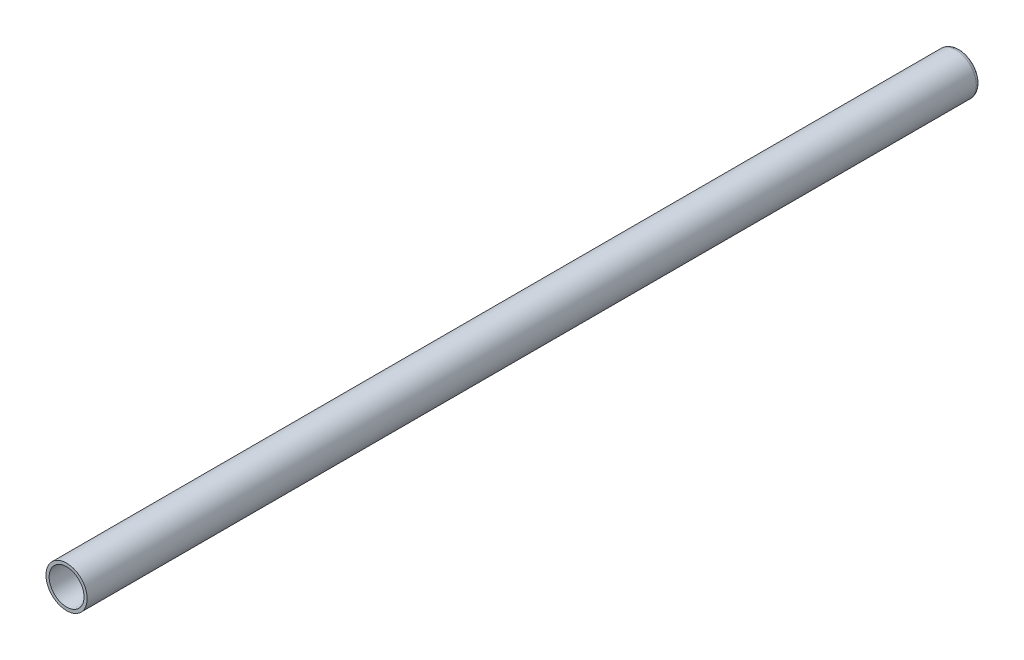
ISO-10303-21;
HEADER;
FILE_DESCRIPTION(('STEP AP214'),'2;1');
FILE_NAME('part.step','',(''),(''),'','','');
FILE_SCHEMA(('AUTOMOTIVE_DESIGN { 1 0 10303 214 1 1 1 1 }'));
ENDSEC;
DATA;
#1=APPLICATION_CONTEXT('core data for automotive mechanical design processes');
#2=APPLICATION_PROTOCOL_DEFINITION('international standard','automotive_design',2000,#1);
#3=PRODUCT_CONTEXT('',#1,'mechanical');
#4=PRODUCT('Part','Part','',(#3));
#5=PRODUCT_RELATED_PRODUCT_CATEGORY('part','',(#4));
#6=PRODUCT_DEFINITION_FORMATION('','',#4);
#7=PRODUCT_DEFINITION_CONTEXT('part definition',#1,'design');
#8=PRODUCT_DEFINITION('design','',#6,#7);
#9=PRODUCT_DEFINITION_SHAPE('','',#8);
#10=(LENGTH_UNIT() NAMED_UNIT(*) SI_UNIT(.MILLI.,.METRE.));
#11=(NAMED_UNIT(*) PLANE_ANGLE_UNIT() SI_UNIT($,.RADIAN.));
#12=(NAMED_UNIT(*) SI_UNIT($,.STERADIAN.) SOLID_ANGLE_UNIT());
#13=UNCERTAINTY_MEASURE_WITH_UNIT(LENGTH_MEASURE(1.E-05),#10,'distance_accuracy_value','');
#14=(GEOMETRIC_REPRESENTATION_CONTEXT(3) GLOBAL_UNCERTAINTY_ASSIGNED_CONTEXT((#13)) GLOBAL_UNIT_ASSIGNED_CONTEXT((#10,
#11,#12)) REPRESENTATION_CONTEXT('',''));
#15=CARTESIAN_POINT('',(0.,0.,0.));
#16=DIRECTION('',(0.,0.,1.));
#17=DIRECTION('',(1.,0.,0.));
#18=AXIS2_PLACEMENT_3D('',#15,#16,#17);
#19=CARTESIAN_POINT('',(0.,0.,-650.));
#20=DIRECTION('',(0.,0.,1.));
#21=DIRECTION('',(1.,0.,0.));
#22=AXIS2_PLACEMENT_3D('',#19,#20,#21);
#23=CYLINDRICAL_SURFACE('',#22,15.);
#24=CARTESIAN_POINT('',(0.,0.,-647.));
#25=DIRECTION('',(0.,0.,1.));
#26=DIRECTION('',(1.,0.,0.));
#27=AXIS2_PLACEMENT_3D('',#24,#25,#26);
#28=CIRCLE('',#27,15.);
#29=CARTESIAN_POINT('',(15.,0.,-647.));
#30=VERTEX_POINT('',#29);
#31=EDGE_CURVE('E40',#30,#30,#28,.T.);
#32=ORIENTED_EDGE('',*,*,#31,.T.);
#33=EDGE_LOOP('',(#32));
#34=FACE_BOUND('',#33,.T.);
#35=CARTESIAN_POINT('',(0.,0.,0.));
#36=DIRECTION('',(0.,0.,1.));
#37=DIRECTION('',(1.,0.,0.));
#38=AXIS2_PLACEMENT_3D('',#35,#36,#37);
#39=CIRCLE('',#38,15.);
#40=CARTESIAN_POINT('',(15.,0.,0.));
#41=VERTEX_POINT('',#40);
#42=EDGE_CURVE('E44',#41,#41,#39,.T.);
#43=ORIENTED_EDGE('',*,*,#42,.F.);
#44=EDGE_LOOP('',(#43));
#45=FACE_BOUND('',#44,.T.);
#46=ADVANCED_FACE('F33',(#34,#45),#23,.T.);
#47=CARTESIAN_POINT('',(0.,0.,-650.));
#48=DIRECTION('',(0.,0.,1.));
#49=DIRECTION('',(1.,0.,0.));
#50=AXIS2_PLACEMENT_3D('',#47,#48,#49);
#51=PLANE('',#50);
#52=CARTESIAN_POINT('',(0.,0.,-650.));
#53=DIRECTION('',(0.,0.,1.));
#54=DIRECTION('',(1.,0.,0.));
#55=AXIS2_PLACEMENT_3D('',#52,#53,#54);
#56=CIRCLE('',#55,12.);
#57=CARTESIAN_POINT('',(12.,0.,-650.));
#58=VERTEX_POINT('',#57);
#59=EDGE_CURVE('E10',#58,#58,#56,.F.);
#60=ORIENTED_EDGE('',*,*,#59,.T.);
#61=EDGE_LOOP('',(#60));
#62=FACE_BOUND('',#61,.T.);
#63=ADVANCED_FACE('F68',(#62),#51,.F.);
#64=CARTESIAN_POINT('',(0.,0.,0.));
#65=DIRECTION('',(0.,0.,1.));
#66=DIRECTION('',(1.,0.,0.));
#67=AXIS2_PLACEMENT_3D('',#64,#65,#66);
#68=PLANE('',#67);
#69=CARTESIAN_POINT('',(0.,0.,0.));
#70=DIRECTION('',(0.,0.,1.));
#71=DIRECTION('',(1.,0.,0.));
#72=AXIS2_PLACEMENT_3D('',#69,#70,#71);
#73=CIRCLE('',#72,12.7);
#74=CARTESIAN_POINT('',(12.7,0.,0.));
#75=VERTEX_POINT('',#74);
#76=EDGE_CURVE('E51',#75,#75,#73,.T.);
#77=ORIENTED_EDGE('',*,*,#76,.F.);
#78=EDGE_LOOP('',(#77));
#79=FACE_BOUND('',#78,.T.);
#80=ORIENTED_EDGE('',*,*,#42,.T.);
#81=EDGE_LOOP('',(#80));
#82=FACE_BOUND('',#81,.T.);
#83=ADVANCED_FACE('F62',(#79,#82),#68,.T.);
#84=CARTESIAN_POINT('',(0.,0.,-640.));
#85=DIRECTION('',(0.,0.,1.));
#86=DIRECTION('',(1.,0.,0.));
#87=AXIS2_PLACEMENT_3D('',#84,#85,#86);
#88=CYLINDRICAL_SURFACE('',#87,12.7);
#89=CARTESIAN_POINT('',(0.,0.,-640.));
#90=DIRECTION('',(0.,0.,1.));
#91=DIRECTION('',(1.,0.,0.));
#92=AXIS2_PLACEMENT_3D('',#89,#90,#91);
#93=CIRCLE('',#92,12.7);
#94=CARTESIAN_POINT('',(12.7,0.,-640.));
#95=VERTEX_POINT('',#94);
#96=EDGE_CURVE('E48',#95,#95,#93,.T.);
#97=ORIENTED_EDGE('',*,*,#96,.F.);
#98=EDGE_LOOP('',(#97));
#99=FACE_BOUND('',#98,.T.);
#100=ORIENTED_EDGE('',*,*,#76,.T.);
#101=EDGE_LOOP('',(#100));
#102=FACE_BOUND('',#101,.T.);
#103=ADVANCED_FACE('F59',(#99,#102),#88,.F.);
#104=CARTESIAN_POINT('',(0.,0.,-640.));
#105=DIRECTION('',(0.,0.,1.));
#106=DIRECTION('',(1.,0.,0.));
#107=AXIS2_PLACEMENT_3D('',#104,#105,#106);
#108=PLANE('',#107);
#109=ORIENTED_EDGE('',*,*,#96,.T.);
#110=EDGE_LOOP('',(#109));
#111=FACE_BOUND('',#110,.T.);
#112=ADVANCED_FACE('F57',(#111),#108,.T.);
#113=CARTESIAN_POINT('',(0.,0.,-647.));
#114=DIRECTION('',(0.,0.,1.));
#115=DIRECTION('',(1.,0.,0.));
#116=AXIS2_PLACEMENT_3D('',#113,#114,#115);
#117=TOROIDAL_SURFACE('',#116,12.,3.);
#118=ORIENTED_EDGE('',*,*,#59,.F.);
#119=EDGE_LOOP('',(#118));
#120=FACE_BOUND('',#119,.T.);
#121=ORIENTED_EDGE('',*,*,#31,.F.);
#122=EDGE_LOOP('',(#121));
#123=FACE_BOUND('',#122,.T.);
#124=ADVANCED_FACE('F35',(#120,#123),#117,.T.);
#125=CLOSED_SHELL('',(#46,#63,#83,#103,#112,#124));
#126=MANIFOLD_SOLID_BREP('B2',#125);
#127=ADVANCED_BREP_SHAPE_REPRESENTATION('',(#18,#126),#14);
#128=SHAPE_DEFINITION_REPRESENTATION(#9,#127);
ENDSEC;
END-ISO-10303-21;
